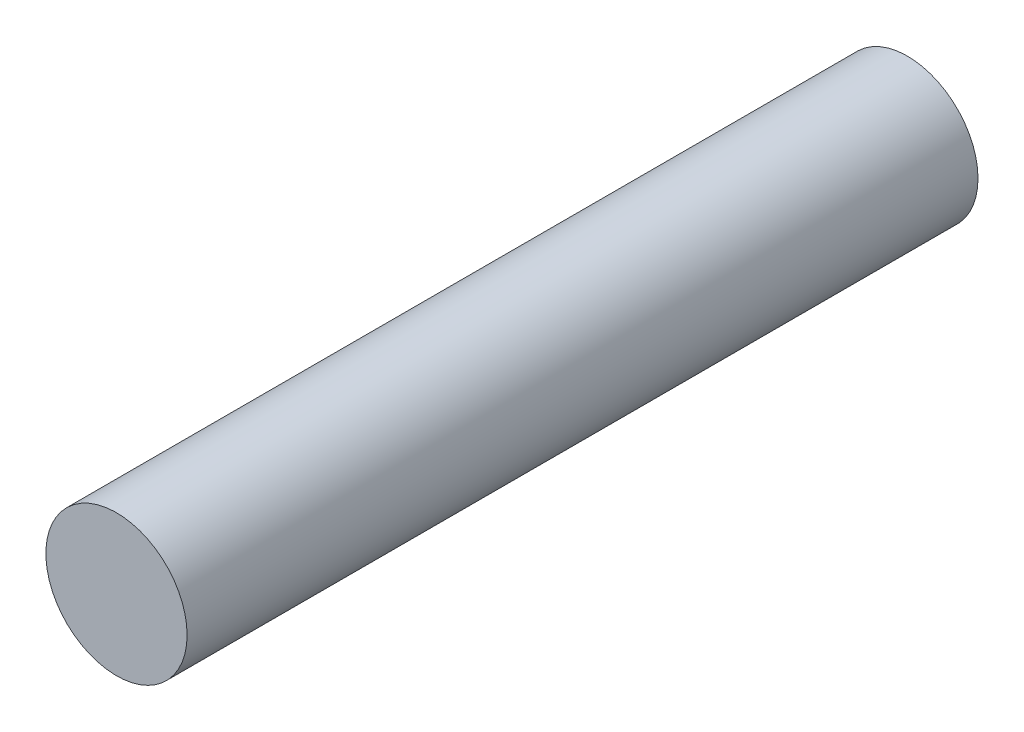
ISO-10303-21;
HEADER;
FILE_DESCRIPTION(('STEP AP214'),'2;1');
FILE_NAME('part.step','',(''),(''),'','','');
FILE_SCHEMA(('AUTOMOTIVE_DESIGN { 1 0 10303 214 1 1 1 1 }'));
ENDSEC;
DATA;
#1=APPLICATION_CONTEXT('core data for automotive mechanical design processes');
#2=APPLICATION_PROTOCOL_DEFINITION('international standard','automotive_design',2000,#1);
#3=PRODUCT_CONTEXT('',#1,'mechanical');
#4=PRODUCT('Part','Part','',(#3));
#5=PRODUCT_RELATED_PRODUCT_CATEGORY('part','',(#4));
#6=PRODUCT_DEFINITION_FORMATION('','',#4);
#7=PRODUCT_DEFINITION_CONTEXT('part definition',#1,'design');
#8=PRODUCT_DEFINITION('design','',#6,#7);
#9=PRODUCT_DEFINITION_SHAPE('','',#8);
#10=(LENGTH_UNIT() NAMED_UNIT(*) SI_UNIT(.MILLI.,.METRE.));
#11=(NAMED_UNIT(*) PLANE_ANGLE_UNIT() SI_UNIT($,.RADIAN.));
#12=(NAMED_UNIT(*) SI_UNIT($,.STERADIAN.) SOLID_ANGLE_UNIT());
#13=UNCERTAINTY_MEASURE_WITH_UNIT(LENGTH_MEASURE(1.E-05),#10,'distance_accuracy_value','');
#14=(GEOMETRIC_REPRESENTATION_CONTEXT(3) GLOBAL_UNCERTAINTY_ASSIGNED_CONTEXT((#13)) GLOBAL_UNIT_ASSIGNED_CONTEXT((#10,
#11,#12)) REPRESENTATION_CONTEXT('',''));
#15=CARTESIAN_POINT('',(0.,0.,0.));
#16=DIRECTION('',(0.,0.,1.));
#17=DIRECTION('',(1.,0.,0.));
#18=AXIS2_PLACEMENT_3D('',#15,#16,#17);
#19=CARTESIAN_POINT('',(-3.33066907387547E-13,1.11022302462516E-13,44.45));
#20=DIRECTION('',(0.,0.,-1.));
#21=DIRECTION('',(-1.,0.,0.));
#22=AXIS2_PLACEMENT_3D('',#19,#20,#21);
#23=CYLINDRICAL_SURFACE('',#22,3.96875);
#24=CARTESIAN_POINT('',(-3.33066907387547E-13,1.11022302462516E-13,44.45));
#25=DIRECTION('',(0.,0.,1.));
#26=DIRECTION('',(1.,0.,0.));
#27=AXIS2_PLACEMENT_3D('',#24,#25,#26);
#28=CIRCLE('',#27,3.96875);
#29=CARTESIAN_POINT('',(3.96874999999967,1.11517999695776E-13,44.45));
#30=VERTEX_POINT('',#29);
#31=EDGE_CURVE('E10',#30,#30,#28,.T.);
#32=ORIENTED_EDGE('',*,*,#31,.F.);
#33=EDGE_LOOP('',(#32));
#34=FACE_BOUND('',#33,.T.);
#35=CARTESIAN_POINT('',(0.,0.,0.));
#36=DIRECTION('',(0.,0.,1.));
#37=DIRECTION('',(1.,0.,0.));
#38=AXIS2_PLACEMENT_3D('',#35,#36,#37);
#39=CIRCLE('',#38,3.96875);
#40=CARTESIAN_POINT('',(3.96875,0.,0.));
#41=VERTEX_POINT('',#40);
#42=EDGE_CURVE('E40',#41,#41,#39,.T.);
#43=ORIENTED_EDGE('',*,*,#42,.T.);
#44=EDGE_LOOP('',(#43));
#45=FACE_BOUND('',#44,.T.);
#46=ADVANCED_FACE('F37',(#34,#45),#23,.T.);
#47=CARTESIAN_POINT('',(-3.33066907387547E-13,1.11022302462516E-13,44.45));
#48=DIRECTION('',(0.,0.,1.));
#49=DIRECTION('',(1.,0.,0.));
#50=AXIS2_PLACEMENT_3D('',#47,#48,#49);
#51=PLANE('',#50);
#52=ORIENTED_EDGE('',*,*,#31,.T.);
#53=EDGE_LOOP('',(#52));
#54=FACE_BOUND('',#53,.T.);
#55=ADVANCED_FACE('F52',(#54),#51,.T.);
#56=CARTESIAN_POINT('',(0.,0.,0.));
#57=DIRECTION('',(0.,0.,1.));
#58=DIRECTION('',(1.,0.,0.));
#59=AXIS2_PLACEMENT_3D('',#56,#57,#58);
#60=PLANE('',#59);
#61=ORIENTED_EDGE('',*,*,#42,.F.);
#62=EDGE_LOOP('',(#61));
#63=FACE_BOUND('',#62,.T.);
#64=ADVANCED_FACE('F50',(#63),#60,.F.);
#65=CLOSED_SHELL('',(#46,#55,#64));
#66=MANIFOLD_SOLID_BREP('B2',#65);
#67=ADVANCED_BREP_SHAPE_REPRESENTATION('',(#18,#66),#14);
#68=SHAPE_DEFINITION_REPRESENTATION(#9,#67);
ENDSEC;
END-ISO-10303-21;
